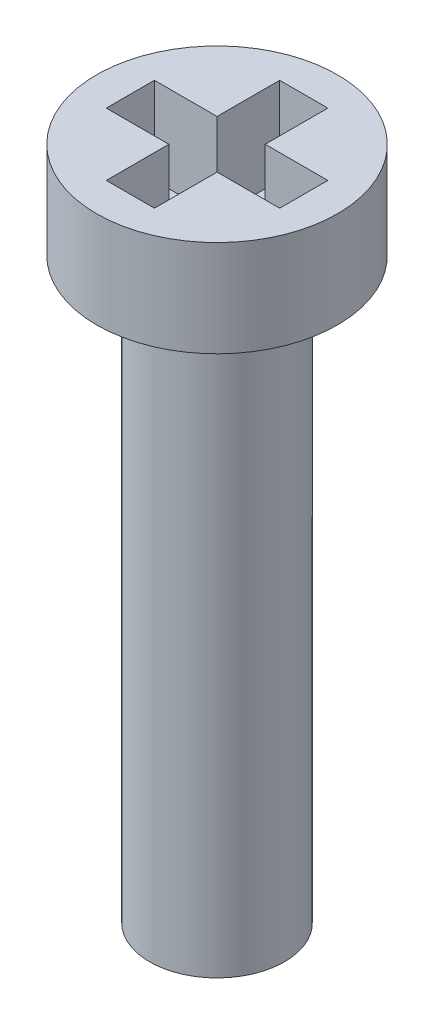
ISO-10303-21;
HEADER;
FILE_DESCRIPTION(('STEP AP214'),'2;1');
FILE_NAME('part.step','',(''),(''),'','','');
FILE_SCHEMA(('AUTOMOTIVE_DESIGN { 1 0 10303 214 1 1 1 1 }'));
ENDSEC;
DATA;
#1=APPLICATION_CONTEXT('core data for automotive mechanical design processes');
#2=APPLICATION_PROTOCOL_DEFINITION('international standard','automotive_design',2000,#1);
#3=PRODUCT_CONTEXT('',#1,'mechanical');
#4=PRODUCT('Part','Part','',(#3));
#5=PRODUCT_RELATED_PRODUCT_CATEGORY('part','',(#4));
#6=PRODUCT_DEFINITION_FORMATION('','',#4);
#7=PRODUCT_DEFINITION_CONTEXT('part definition',#1,'design');
#8=PRODUCT_DEFINITION('design','',#6,#7);
#9=PRODUCT_DEFINITION_SHAPE('','',#8);
#10=(LENGTH_UNIT() NAMED_UNIT(*) SI_UNIT(.MILLI.,.METRE.));
#11=(NAMED_UNIT(*) PLANE_ANGLE_UNIT() SI_UNIT($,.RADIAN.));
#12=(NAMED_UNIT(*) SI_UNIT($,.STERADIAN.) SOLID_ANGLE_UNIT());
#13=UNCERTAINTY_MEASURE_WITH_UNIT(LENGTH_MEASURE(1.E-05),#10,'distance_accuracy_value','');
#14=(GEOMETRIC_REPRESENTATION_CONTEXT(3) GLOBAL_UNCERTAINTY_ASSIGNED_CONTEXT((#13)) GLOBAL_UNIT_ASSIGNED_CONTEXT((#10,
#11,#12)) REPRESENTATION_CONTEXT('',''));
#15=CARTESIAN_POINT('',(0.,0.,0.));
#16=DIRECTION('',(0.,0.,1.));
#17=DIRECTION('',(1.,0.,0.));
#18=AXIS2_PLACEMENT_3D('',#15,#16,#17);
#19=CARTESIAN_POINT('',(0.,1.,0.9));
#20=DIRECTION('',(0.,0.,1.));
#21=DIRECTION('',(1.,0.,0.));
#22=AXIS2_PLACEMENT_3D('',#19,#20,#21);
#23=PLANE('',#22);
#24=DIRECTION('',(1.,0.,0.));
#25=VECTOR('',#24,1.);
#26=CARTESIAN_POINT('',(0.,0.1,0.9));
#27=LINE('',#26,#25);
#28=CARTESIAN_POINT('',(-0.25,0.1,0.9));
#29=VERTEX_POINT('',#28);
#30=CARTESIAN_POINT('',(0.25,0.1,0.9));
#31=VERTEX_POINT('',#30);
#32=EDGE_CURVE('E57',#29,#31,#27,.T.);
#33=ORIENTED_EDGE('',*,*,#32,.F.);
#34=DIRECTION('',(0.,-1.,0.));
#35=VECTOR('',#34,1.);
#36=CARTESIAN_POINT('',(-0.25,1.,0.9));
#37=LINE('',#36,#35);
#38=CARTESIAN_POINT('',(-0.25,1.,0.9));
#39=VERTEX_POINT('',#38);
#40=EDGE_CURVE('E44',#39,#29,#37,.T.);
#41=ORIENTED_EDGE('',*,*,#40,.F.);
#42=DIRECTION('',(-1.,0.,0.));
#43=VECTOR('',#42,1.);
#44=CARTESIAN_POINT('',(0.,1.,0.9));
#45=LINE('',#44,#43);
#46=CARTESIAN_POINT('',(0.25,1.,0.9));
#47=VERTEX_POINT('',#46);
#48=EDGE_CURVE('E204',#47,#39,#45,.T.);
#49=ORIENTED_EDGE('',*,*,#48,.F.);
#50=DIRECTION('',(0.,-1.,0.));
#51=VECTOR('',#50,1.);
#52=CARTESIAN_POINT('',(0.25,1.,0.9));
#53=LINE('',#52,#51);
#54=EDGE_CURVE('E64',#47,#31,#53,.T.);
#55=ORIENTED_EDGE('',*,*,#54,.T.);
#56=EDGE_LOOP('',(#33,#41,#49,#55));
#57=FACE_BOUND('',#56,.T.);
#58=ADVANCED_FACE('F41',(#57),#23,.F.);
#59=CARTESIAN_POINT('',(-0.25,1.,0.));
#60=DIRECTION('',(-1.,0.,0.));
#61=DIRECTION('',(0.,0.,1.));
#62=AXIS2_PLACEMENT_3D('',#59,#60,#61);
#63=PLANE('',#62);
#64=DIRECTION('',(0.,0.,1.));
#65=VECTOR('',#64,1.);
#66=CARTESIAN_POINT('',(-0.25,0.1,0.));
#67=LINE('',#66,#65);
#68=CARTESIAN_POINT('',(-0.25,0.1,0.25));
#69=VERTEX_POINT('',#68);
#70=EDGE_CURVE('E200',#69,#29,#67,.T.);
#71=ORIENTED_EDGE('',*,*,#70,.F.);
#72=DIRECTION('',(0.,-1.,0.));
#73=VECTOR('',#72,1.);
#74=CARTESIAN_POINT('',(-0.25,1.,0.25));
#75=LINE('',#74,#73);
#76=CARTESIAN_POINT('',(-0.25,1.,0.25));
#77=VERTEX_POINT('',#76);
#78=EDGE_CURVE('E187',#77,#69,#75,.T.);
#79=ORIENTED_EDGE('',*,*,#78,.F.);
#80=DIRECTION('',(0.,0.,-1.));
#81=VECTOR('',#80,1.);
#82=CARTESIAN_POINT('',(-0.25,1.,0.));
#83=LINE('',#82,#81);
#84=EDGE_CURVE('E201',#39,#77,#83,.T.);
#85=ORIENTED_EDGE('',*,*,#84,.F.);
#86=ORIENTED_EDGE('',*,*,#40,.T.);
#87=EDGE_LOOP('',(#71,#79,#85,#86));
#88=FACE_BOUND('',#87,.T.);
#89=ADVANCED_FACE('F199',(#88),#63,.F.);
#90=CARTESIAN_POINT('',(0.,1.,0.25));
#91=DIRECTION('',(0.,0.,-1.));
#92=DIRECTION('',(-1.,0.,0.));
#93=AXIS2_PLACEMENT_3D('',#90,#91,#92);
#94=PLANE('',#93);
#95=ORIENTED_EDGE('',*,*,#78,.T.);
#96=DIRECTION('',(-1.,0.,0.));
#97=VECTOR('',#96,1.);
#98=CARTESIAN_POINT('',(0.,0.1,0.25));
#99=LINE('',#98,#97);
#100=CARTESIAN_POINT('',(-0.9,0.1,0.25));
#101=VERTEX_POINT('',#100);
#102=EDGE_CURVE('E211',#69,#101,#99,.T.);
#103=ORIENTED_EDGE('',*,*,#102,.T.);
#104=DIRECTION('',(0.,-1.,0.));
#105=VECTOR('',#104,1.);
#106=CARTESIAN_POINT('',(-0.9,1.,0.25));
#107=LINE('',#106,#105);
#108=CARTESIAN_POINT('',(-0.9,1.,0.25));
#109=VERTEX_POINT('',#108);
#110=EDGE_CURVE('E184',#109,#101,#107,.T.);
#111=ORIENTED_EDGE('',*,*,#110,.F.);
#112=DIRECTION('',(1.,0.,0.));
#113=VECTOR('',#112,1.);
#114=CARTESIAN_POINT('',(0.,1.,0.25));
#115=LINE('',#114,#113);
#116=EDGE_CURVE('E219',#109,#77,#115,.T.);
#117=ORIENTED_EDGE('',*,*,#116,.T.);
#118=EDGE_LOOP('',(#95,#103,#111,#117));
#119=FACE_BOUND('',#118,.T.);
#120=ADVANCED_FACE('F281',(#119),#94,.T.);
#121=CARTESIAN_POINT('',(-0.9,1.,0.));
#122=DIRECTION('',(-1.,0.,0.));
#123=DIRECTION('',(0.,0.,1.));
#124=AXIS2_PLACEMENT_3D('',#121,#122,#123);
#125=PLANE('',#124);
#126=DIRECTION('',(0.,0.,1.));
#127=VECTOR('',#126,1.);
#128=CARTESIAN_POINT('',(-0.9,0.1,0.));
#129=LINE('',#128,#127);
#130=CARTESIAN_POINT('',(-0.9,0.1,-0.25));
#131=VERTEX_POINT('',#130);
#132=EDGE_CURVE('E278',#131,#101,#129,.T.);
#133=ORIENTED_EDGE('',*,*,#132,.F.);
#134=DIRECTION('',(0.,-1.,0.));
#135=VECTOR('',#134,1.);
#136=CARTESIAN_POINT('',(-0.9,1.,-0.25));
#137=LINE('',#136,#135);
#138=CARTESIAN_POINT('',(-0.9,1.,-0.25));
#139=VERTEX_POINT('',#138);
#140=EDGE_CURVE('E180',#139,#131,#137,.T.);
#141=ORIENTED_EDGE('',*,*,#140,.F.);
#142=DIRECTION('',(0.,0.,-1.));
#143=VECTOR('',#142,1.);
#144=CARTESIAN_POINT('',(-0.9,1.,0.));
#145=LINE('',#144,#143);
#146=EDGE_CURVE('E223',#109,#139,#145,.T.);
#147=ORIENTED_EDGE('',*,*,#146,.F.);
#148=ORIENTED_EDGE('',*,*,#110,.T.);
#149=EDGE_LOOP('',(#133,#141,#147,#148));
#150=FACE_BOUND('',#149,.T.);
#151=ADVANCED_FACE('F285',(#150),#125,.F.);
#152=CARTESIAN_POINT('',(0.,1.,-0.25));
#153=DIRECTION('',(0.,0.,-1.));
#154=DIRECTION('',(-1.,0.,0.));
#155=AXIS2_PLACEMENT_3D('',#152,#153,#154);
#156=PLANE('',#155);
#157=DIRECTION('',(-1.,0.,0.));
#158=VECTOR('',#157,1.);
#159=CARTESIAN_POINT('',(0.,0.1,-0.25));
#160=LINE('',#159,#158);
#161=CARTESIAN_POINT('',(-0.25,0.1,-0.25));
#162=VERTEX_POINT('',#161);
#163=EDGE_CURVE('E275',#162,#131,#160,.T.);
#164=ORIENTED_EDGE('',*,*,#163,.F.);
#165=DIRECTION('',(0.,-1.,0.));
#166=VECTOR('',#165,1.);
#167=CARTESIAN_POINT('',(-0.25,1.,-0.25));
#168=LINE('',#167,#166);
#169=CARTESIAN_POINT('',(-0.25,1.,-0.25));
#170=VERTEX_POINT('',#169);
#171=EDGE_CURVE('E176',#170,#162,#168,.T.);
#172=ORIENTED_EDGE('',*,*,#171,.F.);
#173=DIRECTION('',(1.,0.,0.));
#174=VECTOR('',#173,1.);
#175=CARTESIAN_POINT('',(0.,1.,-0.25));
#176=LINE('',#175,#174);
#177=EDGE_CURVE('E227',#139,#170,#176,.T.);
#178=ORIENTED_EDGE('',*,*,#177,.F.);
#179=ORIENTED_EDGE('',*,*,#140,.T.);
#180=EDGE_LOOP('',(#164,#172,#178,#179));
#181=FACE_BOUND('',#180,.T.);
#182=ADVANCED_FACE('F295',(#181),#156,.F.);
#183=DIRECTION('',(0.,0.,1.));
#184=VECTOR('',#183,1.);
#185=CARTESIAN_POINT('',(-0.25,0.1,0.));
#186=LINE('',#185,#184);
#187=CARTESIAN_POINT('',(-0.25,0.1,-0.9));
#188=VERTEX_POINT('',#187);
#189=EDGE_CURVE('E272',#188,#162,#186,.T.);
#190=ORIENTED_EDGE('',*,*,#189,.F.);
#191=DIRECTION('',(0.,-1.,0.));
#192=VECTOR('',#191,1.);
#193=CARTESIAN_POINT('',(-0.25,1.,-0.9));
#194=LINE('',#193,#192);
#195=CARTESIAN_POINT('',(-0.25,1.,-0.9));
#196=VERTEX_POINT('',#195);
#197=EDGE_CURVE('E172',#196,#188,#194,.T.);
#198=ORIENTED_EDGE('',*,*,#197,.F.);
#199=EDGE_CURVE('E220',#170,#196,#83,.T.);
#200=ORIENTED_EDGE('',*,*,#199,.F.);
#201=ORIENTED_EDGE('',*,*,#171,.T.);
#202=EDGE_LOOP('',(#190,#198,#200,#201));
#203=FACE_BOUND('',#202,.T.);
#204=ADVANCED_FACE('F298',(#203),#63,.F.);
#205=CARTESIAN_POINT('',(0.,1.,-0.9));
#206=DIRECTION('',(0.,0.,1.));
#207=DIRECTION('',(1.,0.,0.));
#208=AXIS2_PLACEMENT_3D('',#205,#206,#207);
#209=PLANE('',#208);
#210=ORIENTED_EDGE('',*,*,#197,.T.);
#211=DIRECTION('',(1.,0.,0.));
#212=VECTOR('',#211,1.);
#213=CARTESIAN_POINT('',(0.,0.1,-0.9));
#214=LINE('',#213,#212);
#215=CARTESIAN_POINT('',(0.25,0.1,-0.9));
#216=VERTEX_POINT('',#215);
#217=EDGE_CURVE('E268',#188,#216,#214,.T.);
#218=ORIENTED_EDGE('',*,*,#217,.T.);
#219=DIRECTION('',(0.,-1.,0.));
#220=VECTOR('',#219,1.);
#221=CARTESIAN_POINT('',(0.25,1.,-0.9));
#222=LINE('',#221,#220);
#223=CARTESIAN_POINT('',(0.25,1.,-0.9));
#224=VERTEX_POINT('',#223);
#225=EDGE_CURVE('E168',#224,#216,#222,.T.);
#226=ORIENTED_EDGE('',*,*,#225,.F.);
#227=DIRECTION('',(-1.,0.,0.));
#228=VECTOR('',#227,1.);
#229=CARTESIAN_POINT('',(0.,1.,-0.9));
#230=LINE('',#229,#228);
#231=EDGE_CURVE('E231',#224,#196,#230,.T.);
#232=ORIENTED_EDGE('',*,*,#231,.T.);
#233=EDGE_LOOP('',(#210,#218,#226,#232));
#234=FACE_BOUND('',#233,.T.);
#235=ADVANCED_FACE('F302',(#234),#209,.T.);
#236=CARTESIAN_POINT('',(0.25,1.,0.));
#237=DIRECTION('',(-1.,0.,0.));
#238=DIRECTION('',(0.,0.,1.));
#239=AXIS2_PLACEMENT_3D('',#236,#237,#238);
#240=PLANE('',#239);
#241=ORIENTED_EDGE('',*,*,#225,.T.);
#242=DIRECTION('',(0.,0.,1.));
#243=VECTOR('',#242,1.);
#244=CARTESIAN_POINT('',(0.25,0.1,0.));
#245=LINE('',#244,#243);
#246=CARTESIAN_POINT('',(0.25,0.1,-0.25));
#247=VERTEX_POINT('',#246);
#248=EDGE_CURVE('E262',#216,#247,#245,.T.);
#249=ORIENTED_EDGE('',*,*,#248,.T.);
#250=DIRECTION('',(0.,-1.,0.));
#251=VECTOR('',#250,1.);
#252=CARTESIAN_POINT('',(0.25,1.,-0.25));
#253=LINE('',#252,#251);
#254=CARTESIAN_POINT('',(0.25,1.,-0.25));
#255=VERTEX_POINT('',#254);
#256=EDGE_CURVE('E164',#255,#247,#253,.T.);
#257=ORIENTED_EDGE('',*,*,#256,.F.);
#258=DIRECTION('',(0.,0.,-1.));
#259=VECTOR('',#258,1.);
#260=CARTESIAN_POINT('',(0.25,1.,0.));
#261=LINE('',#260,#259);
#262=EDGE_CURVE('E235',#255,#224,#261,.T.);
#263=ORIENTED_EDGE('',*,*,#262,.T.);
#264=EDGE_LOOP('',(#241,#249,#257,#263));
#265=FACE_BOUND('',#264,.T.);
#266=ADVANCED_FACE('F304',(#265),#240,.T.);
#267=DIRECTION('',(-1.,0.,0.));
#268=VECTOR('',#267,1.);
#269=CARTESIAN_POINT('',(0.,0.1,-0.25));
#270=LINE('',#269,#268);
#271=CARTESIAN_POINT('',(0.9,0.1,-0.25));
#272=VERTEX_POINT('',#271);
#273=EDGE_CURVE('E259',#272,#247,#270,.T.);
#274=ORIENTED_EDGE('',*,*,#273,.F.);
#275=DIRECTION('',(0.,-1.,0.));
#276=VECTOR('',#275,1.);
#277=CARTESIAN_POINT('',(0.9,1.,-0.25));
#278=LINE('',#277,#276);
#279=CARTESIAN_POINT('',(0.9,1.,-0.25));
#280=VERTEX_POINT('',#279);
#281=EDGE_CURVE('E155',#280,#272,#278,.T.);
#282=ORIENTED_EDGE('',*,*,#281,.F.);
#283=EDGE_CURVE('E230',#255,#280,#176,.T.);
#284=ORIENTED_EDGE('',*,*,#283,.F.);
#285=ORIENTED_EDGE('',*,*,#256,.T.);
#286=EDGE_LOOP('',(#274,#282,#284,#285));
#287=FACE_BOUND('',#286,.T.);
#288=ADVANCED_FACE('F306',(#287),#156,.F.);
#289=CARTESIAN_POINT('',(0.9,1.,0.));
#290=DIRECTION('',(-1.,0.,0.));
#291=DIRECTION('',(0.,0.,1.));
#292=AXIS2_PLACEMENT_3D('',#289,#290,#291);
#293=PLANE('',#292);
#294=ORIENTED_EDGE('',*,*,#281,.T.);
#295=DIRECTION('',(0.,0.,1.));
#296=VECTOR('',#295,1.);
#297=CARTESIAN_POINT('',(0.9,0.1,0.));
#298=LINE('',#297,#296);
#299=CARTESIAN_POINT('',(0.9,0.1,0.25));
#300=VERTEX_POINT('',#299);
#301=EDGE_CURVE('E146',#272,#300,#298,.T.);
#302=ORIENTED_EDGE('',*,*,#301,.T.);
#303=DIRECTION('',(0.,-1.,0.));
#304=VECTOR('',#303,1.);
#305=CARTESIAN_POINT('',(0.9,1.,0.25));
#306=LINE('',#305,#304);
#307=CARTESIAN_POINT('',(0.9,1.,0.25));
#308=VERTEX_POINT('',#307);
#309=EDGE_CURVE('E144',#308,#300,#306,.T.);
#310=ORIENTED_EDGE('',*,*,#309,.F.);
#311=DIRECTION('',(0.,0.,-1.));
#312=VECTOR('',#311,1.);
#313=CARTESIAN_POINT('',(0.9,1.,0.));
#314=LINE('',#313,#312);
#315=EDGE_CURVE('E239',#308,#280,#314,.T.);
#316=ORIENTED_EDGE('',*,*,#315,.T.);
#317=EDGE_LOOP('',(#294,#302,#310,#316));
#318=FACE_BOUND('',#317,.T.);
#319=ADVANCED_FACE('F256',(#318),#293,.T.);
#320=ORIENTED_EDGE('',*,*,#309,.T.);
#321=DIRECTION('',(-1.,0.,0.));
#322=VECTOR('',#321,1.);
#323=CARTESIAN_POINT('',(0.,0.1,0.25));
#324=LINE('',#323,#322);
#325=CARTESIAN_POINT('',(0.25,0.1,0.25));
#326=VERTEX_POINT('',#325);
#327=EDGE_CURVE('E132',#300,#326,#324,.T.);
#328=ORIENTED_EDGE('',*,*,#327,.T.);
#329=DIRECTION('',(0.,-1.,0.));
#330=VECTOR('',#329,1.);
#331=CARTESIAN_POINT('',(0.25,1.,0.25));
#332=LINE('',#331,#330);
#333=CARTESIAN_POINT('',(0.25,1.,0.25));
#334=VERTEX_POINT('',#333);
#335=EDGE_CURVE('E142',#334,#326,#332,.T.);
#336=ORIENTED_EDGE('',*,*,#335,.F.);
#337=EDGE_CURVE('E224',#334,#308,#115,.T.);
#338=ORIENTED_EDGE('',*,*,#337,.T.);
#339=EDGE_LOOP('',(#320,#328,#336,#338));
#340=FACE_BOUND('',#339,.T.);
#341=ADVANCED_FACE('F140',(#340),#94,.T.);
#342=ORIENTED_EDGE('',*,*,#335,.T.);
#343=DIRECTION('',(0.,0.,1.));
#344=VECTOR('',#343,1.);
#345=CARTESIAN_POINT('',(0.25,0.1,0.));
#346=LINE('',#345,#344);
#347=EDGE_CURVE('E129',#326,#31,#346,.T.);
#348=ORIENTED_EDGE('',*,*,#347,.T.);
#349=ORIENTED_EDGE('',*,*,#54,.F.);
#350=EDGE_CURVE('E150',#47,#334,#261,.T.);
#351=ORIENTED_EDGE('',*,*,#350,.T.);
#352=EDGE_LOOP('',(#342,#348,#349,#351));
#353=FACE_BOUND('',#352,.T.);
#354=ADVANCED_FACE('F148',(#353),#240,.T.);
#355=CARTESIAN_POINT('',(0.,1.,0.));
#356=DIRECTION('',(0.,-1.,0.));
#357=DIRECTION('',(0.,0.,-1.));
#358=AXIS2_PLACEMENT_3D('',#355,#356,#357);
#359=CYLINDRICAL_SURFACE('',#358,1.25);
#360=CARTESIAN_POINT('',(0.,0.,0.));
#361=DIRECTION('',(0.,1.,0.));
#362=DIRECTION('',(0.,0.,1.));
#363=AXIS2_PLACEMENT_3D('',#360,#361,#362);
#364=CIRCLE('',#363,1.25);
#365=CARTESIAN_POINT('',(0.,0.,1.25));
#366=VERTEX_POINT('',#365);
#367=EDGE_CURVE('E206',#366,#366,#364,.T.);
#368=ORIENTED_EDGE('',*,*,#367,.T.);
#369=EDGE_LOOP('',(#368));
#370=FACE_BOUND('',#369,.T.);
#371=CARTESIAN_POINT('',(0.,1.,0.));
#372=DIRECTION('',(0.,1.,0.));
#373=DIRECTION('',(0.,0.,1.));
#374=AXIS2_PLACEMENT_3D('',#371,#372,#373);
#375=CIRCLE('',#374,1.25);
#376=CARTESIAN_POINT('',(0.,1.,1.25));
#377=VERTEX_POINT('',#376);
#378=EDGE_CURVE('E157',#377,#377,#375,.T.);
#379=ORIENTED_EDGE('',*,*,#378,.F.);
#380=EDGE_LOOP('',(#379));
#381=FACE_BOUND('',#380,.T.);
#382=ADVANCED_FACE('F362',(#370,#381),#359,.T.);
#383=CARTESIAN_POINT('',(0.,1.,0.));
#384=DIRECTION('',(0.,1.,0.));
#385=DIRECTION('',(0.,0.,1.));
#386=AXIS2_PLACEMENT_3D('',#383,#384,#385);
#387=PLANE('',#386);
#388=ORIENTED_EDGE('',*,*,#48,.T.);
#389=ORIENTED_EDGE('',*,*,#84,.T.);
#390=ORIENTED_EDGE('',*,*,#116,.F.);
#391=ORIENTED_EDGE('',*,*,#146,.T.);
#392=ORIENTED_EDGE('',*,*,#177,.T.);
#393=ORIENTED_EDGE('',*,*,#199,.T.);
#394=ORIENTED_EDGE('',*,*,#231,.F.);
#395=ORIENTED_EDGE('',*,*,#262,.F.);
#396=ORIENTED_EDGE('',*,*,#283,.T.);
#397=ORIENTED_EDGE('',*,*,#315,.F.);
#398=ORIENTED_EDGE('',*,*,#337,.F.);
#399=ORIENTED_EDGE('',*,*,#350,.F.);
#400=EDGE_LOOP('',(#388,#389,#390,#391,#392,#393,#394,#395,#396,#397,#398,#399));
#401=FACE_BOUND('',#400,.T.);
#402=ORIENTED_EDGE('',*,*,#378,.T.);
#403=EDGE_LOOP('',(#402));
#404=FACE_BOUND('',#403,.T.);
#405=ADVANCED_FACE('F251',(#401,#404),#387,.T.);
#406=CARTESIAN_POINT('',(0.,0.,0.));
#407=DIRECTION('',(0.,1.,0.));
#408=DIRECTION('',(0.,0.,1.));
#409=AXIS2_PLACEMENT_3D('',#406,#407,#408);
#410=PLANE('',#409);
#411=CARTESIAN_POINT('',(0.,0.,0.));
#412=DIRECTION('',(0.,-1.,0.));
#413=DIRECTION('',(0.,0.,-1.));
#414=AXIS2_PLACEMENT_3D('',#411,#412,#413);
#415=CIRCLE('',#414,0.7);
#416=CARTESIAN_POINT('',(0.,0.,-0.7));
#417=VERTEX_POINT('',#416);
#418=EDGE_CURVE('E11',#417,#417,#415,.T.);
#419=ORIENTED_EDGE('',*,*,#418,.F.);
#420=EDGE_LOOP('',(#419));
#421=FACE_BOUND('',#420,.T.);
#422=ORIENTED_EDGE('',*,*,#367,.F.);
#423=EDGE_LOOP('',(#422));
#424=FACE_BOUND('',#423,.T.);
#425=ADVANCED_FACE('F383',(#421,#424),#410,.F.);
#426=CARTESIAN_POINT('',(0.,0.1,0.));
#427=DIRECTION('',(0.,-1.,0.));
#428=DIRECTION('',(0.,0.,-1.));
#429=AXIS2_PLACEMENT_3D('',#426,#427,#428);
#430=PLANE('',#429);
#431=ORIENTED_EDGE('',*,*,#70,.T.);
#432=ORIENTED_EDGE('',*,*,#32,.T.);
#433=ORIENTED_EDGE('',*,*,#347,.F.);
#434=ORIENTED_EDGE('',*,*,#327,.F.);
#435=ORIENTED_EDGE('',*,*,#301,.F.);
#436=ORIENTED_EDGE('',*,*,#273,.T.);
#437=ORIENTED_EDGE('',*,*,#248,.F.);
#438=ORIENTED_EDGE('',*,*,#217,.F.);
#439=ORIENTED_EDGE('',*,*,#189,.T.);
#440=ORIENTED_EDGE('',*,*,#163,.T.);
#441=ORIENTED_EDGE('',*,*,#132,.T.);
#442=ORIENTED_EDGE('',*,*,#102,.F.);
#443=EDGE_LOOP('',(#431,#432,#433,#434,#435,#436,#437,#438,#439,#440,#441,#442));
#444=FACE_BOUND('',#443,.T.);
#445=ADVANCED_FACE('F131',(#444),#430,.F.);
#446=CARTESIAN_POINT('',(0.,-6.,0.));
#447=DIRECTION('',(0.,1.,0.));
#448=DIRECTION('',(0.,0.,1.));
#449=AXIS2_PLACEMENT_3D('',#446,#447,#448);
#450=CYLINDRICAL_SURFACE('',#449,0.7);
#451=CARTESIAN_POINT('',(0.,-6.,0.));
#452=DIRECTION('',(0.,-1.,0.));
#453=DIRECTION('',(0.,0.,-1.));
#454=AXIS2_PLACEMENT_3D('',#451,#452,#453);
#455=CIRCLE('',#454,0.7);
#456=CARTESIAN_POINT('',(0.,-6.,-0.7));
#457=VERTEX_POINT('',#456);
#458=EDGE_CURVE('E136',#457,#457,#455,.T.);
#459=ORIENTED_EDGE('',*,*,#458,.F.);
#460=EDGE_LOOP('',(#459));
#461=FACE_BOUND('',#460,.T.);
#462=ORIENTED_EDGE('',*,*,#418,.T.);
#463=EDGE_LOOP('',(#462));
#464=FACE_BOUND('',#463,.T.);
#465=ADVANCED_FACE('F382',(#461,#464),#450,.T.);
#466=CARTESIAN_POINT('',(0.,-6.,0.));
#467=DIRECTION('',(0.,-1.,0.));
#468=DIRECTION('',(0.,0.,-1.));
#469=AXIS2_PLACEMENT_3D('',#466,#467,#468);
#470=PLANE('',#469);
#471=ORIENTED_EDGE('',*,*,#458,.T.);
#472=EDGE_LOOP('',(#471));
#473=FACE_BOUND('',#472,.T.);
#474=ADVANCED_FACE('F402',(#473),#470,.T.);
#475=CLOSED_SHELL('',(#58,#89,#120,#151,#182,#204,#235,#266,#288,#319,#341,#354,#382,#405,#425,
#445,#465,#474));
#476=MANIFOLD_SOLID_BREP('B2',#475);
#477=ADVANCED_BREP_SHAPE_REPRESENTATION('',(#18,#476),#14);
#478=SHAPE_DEFINITION_REPRESENTATION(#9,#477);
ENDSEC;
END-ISO-10303-21;
